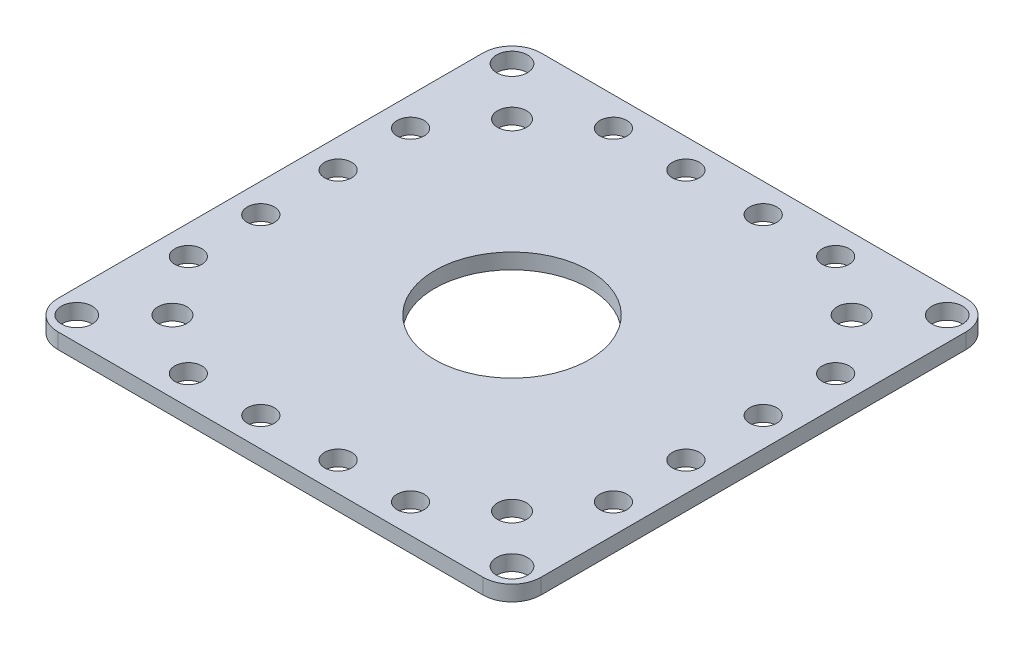
ISO-10303-21;
HEADER;
FILE_DESCRIPTION(('STEP AP214'),'2;1');
FILE_NAME('part.step','',(''),(''),'','','');
FILE_SCHEMA(('AUTOMOTIVE_DESIGN { 1 0 10303 214 1 1 1 1 }'));
ENDSEC;
DATA;
#1=APPLICATION_CONTEXT('core data for automotive mechanical design processes');
#2=APPLICATION_PROTOCOL_DEFINITION('international standard','automotive_design',2000,#1);
#3=PRODUCT_CONTEXT('',#1,'mechanical');
#4=PRODUCT('Part','Part','',(#3));
#5=PRODUCT_RELATED_PRODUCT_CATEGORY('part','',(#4));
#6=PRODUCT_DEFINITION_FORMATION('','',#4);
#7=PRODUCT_DEFINITION_CONTEXT('part definition',#1,'design');
#8=PRODUCT_DEFINITION('design','',#6,#7);
#9=PRODUCT_DEFINITION_SHAPE('','',#8);
#10=(LENGTH_UNIT() NAMED_UNIT(*) SI_UNIT(.MILLI.,.METRE.));
#11=(NAMED_UNIT(*) PLANE_ANGLE_UNIT() SI_UNIT($,.RADIAN.));
#12=(NAMED_UNIT(*) SI_UNIT($,.STERADIAN.) SOLID_ANGLE_UNIT());
#13=UNCERTAINTY_MEASURE_WITH_UNIT(LENGTH_MEASURE(1.E-05),#10,'distance_accuracy_value','');
#14=(GEOMETRIC_REPRESENTATION_CONTEXT(3) GLOBAL_UNCERTAINTY_ASSIGNED_CONTEXT((#13)) GLOBAL_UNIT_ASSIGNED_CONTEXT((#10,
#11,#12)) REPRESENTATION_CONTEXT('',''));
#15=CARTESIAN_POINT('',(0.,0.,0.));
#16=DIRECTION('',(0.,0.,1.));
#17=DIRECTION('',(1.,0.,0.));
#18=AXIS2_PLACEMENT_3D('',#15,#16,#17);
#19=CARTESIAN_POINT('',(0.,1.6,0.));
#20=DIRECTION('',(0.,-1.,0.));
#21=DIRECTION('',(0.,0.,-1.));
#22=AXIS2_PLACEMENT_3D('',#19,#20,#21);
#23=PLANE('',#22);
#24=DIRECTION('',(1.,0.,0.));
#25=VECTOR('',#24,1.);
#26=CARTESIAN_POINT('',(-25.,1.6,25.));
#27=LINE('',#26,#25);
#28=CARTESIAN_POINT('',(-22.,1.6,25.));
#29=VERTEX_POINT('',#28);
#30=CARTESIAN_POINT('',(22.,1.6,25.));
#31=VERTEX_POINT('',#30);
#32=EDGE_CURVE('E158',#29,#31,#27,.T.);
#33=ORIENTED_EDGE('',*,*,#32,.T.);
#34=CARTESIAN_POINT('',(22.,1.6,22.));
#35=DIRECTION('',(0.,-1.,0.));
#36=DIRECTION('',(0.,0.,-1.));
#37=AXIS2_PLACEMENT_3D('',#34,#35,#36);
#38=CIRCLE('',#37,3.);
#39=CARTESIAN_POINT('',(25.,1.6,22.));
#40=VERTEX_POINT('',#39);
#41=EDGE_CURVE('E187',#31,#40,#38,.F.);
#42=ORIENTED_EDGE('',*,*,#41,.T.);
#43=DIRECTION('',(0.,0.,-1.));
#44=VECTOR('',#43,1.);
#45=CARTESIAN_POINT('',(25.,1.6,25.));
#46=LINE('',#45,#44);
#47=CARTESIAN_POINT('',(25.,1.6,-22.));
#48=VERTEX_POINT('',#47);
#49=EDGE_CURVE('E136',#40,#48,#46,.T.);
#50=ORIENTED_EDGE('',*,*,#49,.T.);
#51=CARTESIAN_POINT('',(22.,1.6,-22.));
#52=DIRECTION('',(0.,-1.,0.));
#53=DIRECTION('',(0.,0.,-1.));
#54=AXIS2_PLACEMENT_3D('',#51,#52,#53);
#55=CIRCLE('',#54,3.);
#56=CARTESIAN_POINT('',(22.,1.6,-25.));
#57=VERTEX_POINT('',#56);
#58=EDGE_CURVE('E181',#48,#57,#55,.F.);
#59=ORIENTED_EDGE('',*,*,#58,.T.);
#60=DIRECTION('',(-1.,0.,0.));
#61=VECTOR('',#60,1.);
#62=CARTESIAN_POINT('',(-25.,1.6,-25.));
#63=LINE('',#62,#61);
#64=CARTESIAN_POINT('',(-22.,1.6,-25.));
#65=VERTEX_POINT('',#64);
#66=EDGE_CURVE('E200',#57,#65,#63,.T.);
#67=ORIENTED_EDGE('',*,*,#66,.T.);
#68=CARTESIAN_POINT('',(-22.,1.6,-22.));
#69=DIRECTION('',(0.,-1.,0.));
#70=DIRECTION('',(0.,0.,-1.));
#71=AXIS2_PLACEMENT_3D('',#68,#69,#70);
#72=CIRCLE('',#71,3.);
#73=CARTESIAN_POINT('',(-25.,1.6,-22.));
#74=VERTEX_POINT('',#73);
#75=EDGE_CURVE('E70',#65,#74,#72,.F.);
#76=ORIENTED_EDGE('',*,*,#75,.T.);
#77=DIRECTION('',(0.,0.,1.));
#78=VECTOR('',#77,1.);
#79=CARTESIAN_POINT('',(-25.,1.6,25.));
#80=LINE('',#79,#78);
#81=CARTESIAN_POINT('',(-25.,1.6,22.));
#82=VERTEX_POINT('',#81);
#83=EDGE_CURVE('E207',#74,#82,#80,.T.);
#84=ORIENTED_EDGE('',*,*,#83,.T.);
#85=CARTESIAN_POINT('',(-22.,1.6,22.));
#86=DIRECTION('',(0.,-1.,0.));
#87=DIRECTION('',(0.,0.,-1.));
#88=AXIS2_PLACEMENT_3D('',#85,#86,#87);
#89=CIRCLE('',#88,3.);
#90=EDGE_CURVE('E184',#82,#29,#89,.F.);
#91=ORIENTED_EDGE('',*,*,#90,.T.);
#92=EDGE_LOOP('',(#33,#42,#50,#59,#67,#76,#84,#91));
#93=FACE_BOUND('',#92,.T.);
#94=CARTESIAN_POINT('',(0.,1.6,0.));
#95=DIRECTION('',(0.,1.,0.));
#96=DIRECTION('',(0.,0.,1.));
#97=AXIS2_PLACEMENT_3D('',#94,#95,#96);
#98=CIRCLE('',#97,8.);
#99=CARTESIAN_POINT('',(0.,1.6,8.));
#100=VERTEX_POINT('',#99);
#101=EDGE_CURVE('E147',#100,#100,#98,.T.);
#102=ORIENTED_EDGE('',*,*,#101,.F.);
#103=EDGE_LOOP('',(#102));
#104=FACE_BOUND('',#103,.T.);
#105=CARTESIAN_POINT('',(-22.5251262658471,1.6,-22.5251262658471));
#106=DIRECTION('',(0.,1.,0.));
#107=DIRECTION('',(0.,0.,1.));
#108=AXIS2_PLACEMENT_3D('',#105,#106,#107);
#109=CIRCLE('',#108,1.6);
#110=CARTESIAN_POINT('',(-22.5251262658471,1.6,-20.9251262658471));
#111=VERTEX_POINT('',#110);
#112=EDGE_CURVE('E226',#111,#111,#109,.T.);
#113=ORIENTED_EDGE('',*,*,#112,.F.);
#114=EDGE_LOOP('',(#113));
#115=FACE_BOUND('',#114,.T.);
#116=CARTESIAN_POINT('',(-17.5753787975412,1.6,-17.5753787975413));
#117=DIRECTION('',(0.,1.,0.));
#118=DIRECTION('',(0.,0.,1.));
#119=AXIS2_PLACEMENT_3D('',#116,#117,#118);
#120=CIRCLE('',#119,1.5);
#121=CARTESIAN_POINT('',(-17.5753787975412,1.6,-16.0753787975413));
#122=VERTEX_POINT('',#121);
#123=EDGE_CURVE('E232',#122,#122,#120,.T.);
#124=ORIENTED_EDGE('',*,*,#123,.F.);
#125=EDGE_LOOP('',(#124));
#126=FACE_BOUND('',#125,.T.);
#127=CARTESIAN_POINT('',(-4.,1.6,-22.));
#128=DIRECTION('',(0.,1.,0.));
#129=DIRECTION('',(0.,0.,1.));
#130=AXIS2_PLACEMENT_3D('',#127,#128,#129);
#131=CIRCLE('',#130,1.4);
#132=CARTESIAN_POINT('',(-4.,1.6,-20.6));
#133=VERTEX_POINT('',#132);
#134=EDGE_CURVE('E240',#133,#133,#131,.T.);
#135=ORIENTED_EDGE('',*,*,#134,.F.);
#136=EDGE_LOOP('',(#135));
#137=FACE_BOUND('',#136,.T.);
#138=CARTESIAN_POINT('',(-11.5,1.6,-22.));
#139=DIRECTION('',(0.,1.,0.));
#140=DIRECTION('',(0.,0.,1.));
#141=AXIS2_PLACEMENT_3D('',#138,#139,#140);
#142=CIRCLE('',#141,1.4);
#143=CARTESIAN_POINT('',(-11.5,1.6,-20.6));
#144=VERTEX_POINT('',#143);
#145=EDGE_CURVE('E248',#144,#144,#142,.T.);
#146=ORIENTED_EDGE('',*,*,#145,.F.);
#147=EDGE_LOOP('',(#146));
#148=FACE_BOUND('',#147,.T.);
#149=CARTESIAN_POINT('',(4.,1.6,-22.));
#150=DIRECTION('',(0.,1.,0.));
#151=DIRECTION('',(0.,0.,-1.));
#152=AXIS2_PLACEMENT_3D('',#149,#150,#151);
#153=CIRCLE('',#152,1.4);
#154=CARTESIAN_POINT('',(4.,1.6,-23.4));
#155=VERTEX_POINT('',#154);
#156=EDGE_CURVE('E256',#155,#155,#153,.T.);
#157=ORIENTED_EDGE('',*,*,#156,.F.);
#158=EDGE_LOOP('',(#157));
#159=FACE_BOUND('',#158,.T.);
#160=CARTESIAN_POINT('',(11.5,1.6,-22.));
#161=DIRECTION('',(0.,1.,0.));
#162=DIRECTION('',(0.,0.,-1.));
#163=AXIS2_PLACEMENT_3D('',#160,#161,#162);
#164=CIRCLE('',#163,1.4);
#165=CARTESIAN_POINT('',(11.5,1.6,-23.4));
#166=VERTEX_POINT('',#165);
#167=EDGE_CURVE('E264',#166,#166,#164,.T.);
#168=ORIENTED_EDGE('',*,*,#167,.F.);
#169=EDGE_LOOP('',(#168));
#170=FACE_BOUND('',#169,.T.);
#171=CARTESIAN_POINT('',(22.0000000000012,1.6,-4.00000000000194));
#172=DIRECTION('',(0.,1.,0.));
#173=DIRECTION('',(0.,0.,1.));
#174=AXIS2_PLACEMENT_3D('',#171,#172,#173);
#175=CIRCLE('',#174,1.40000000000159);
#176=CARTESIAN_POINT('',(22.0000000000012,1.6,-2.60000000000035));
#177=VERTEX_POINT('',#176);
#178=EDGE_CURVE('E272',#177,#177,#175,.T.);
#179=ORIENTED_EDGE('',*,*,#178,.F.);
#180=EDGE_LOOP('',(#179));
#181=FACE_BOUND('',#180,.T.);
#182=CARTESIAN_POINT('',(22.0000000000012,1.6,-11.5000000000019));
#183=DIRECTION('',(0.,1.,0.));
#184=DIRECTION('',(0.,0.,1.));
#185=AXIS2_PLACEMENT_3D('',#182,#183,#184);
#186=CIRCLE('',#185,1.4000000000016);
#187=CARTESIAN_POINT('',(22.0000000000012,1.6,-10.1000000000003));
#188=VERTEX_POINT('',#187);
#189=EDGE_CURVE('E280',#188,#188,#186,.T.);
#190=ORIENTED_EDGE('',*,*,#189,.F.);
#191=EDGE_LOOP('',(#190));
#192=FACE_BOUND('',#191,.T.);
#193=CARTESIAN_POINT('',(22.0000000000012,1.6,3.99999999999806));
#194=DIRECTION('',(0.,1.,0.));
#195=DIRECTION('',(0.,0.,-1.));
#196=AXIS2_PLACEMENT_3D('',#193,#194,#195);
#197=CIRCLE('',#196,1.39999999999772);
#198=CARTESIAN_POINT('',(22.0000000000012,1.6,2.60000000000034));
#199=VERTEX_POINT('',#198);
#200=EDGE_CURVE('E288',#199,#199,#197,.T.);
#201=ORIENTED_EDGE('',*,*,#200,.F.);
#202=EDGE_LOOP('',(#201));
#203=FACE_BOUND('',#202,.T.);
#204=CARTESIAN_POINT('',(22.0000000000012,1.6,11.4999999999981));
#205=DIRECTION('',(0.,1.,0.));
#206=DIRECTION('',(0.,0.,-1.));
#207=AXIS2_PLACEMENT_3D('',#204,#205,#206);
#208=CIRCLE('',#207,1.39999999999772);
#209=CARTESIAN_POINT('',(22.0000000000012,1.6,10.1000000000003));
#210=VERTEX_POINT('',#209);
#211=EDGE_CURVE('E296',#210,#210,#208,.T.);
#212=ORIENTED_EDGE('',*,*,#211,.F.);
#213=EDGE_LOOP('',(#212));
#214=FACE_BOUND('',#213,.T.);
#215=CARTESIAN_POINT('',(4.00000000000312,1.6,21.9999999999992));
#216=DIRECTION('',(0.,1.,0.));
#217=DIRECTION('',(0.,0.,1.));
#218=AXIS2_PLACEMENT_3D('',#215,#216,#217);
#219=CIRCLE('',#218,1.40000000000336);
#220=CARTESIAN_POINT('',(4.00000000000312,1.6,23.4000000000026));
#221=VERTEX_POINT('',#220);
#222=EDGE_CURVE('E304',#221,#221,#219,.T.);
#223=ORIENTED_EDGE('',*,*,#222,.F.);
#224=EDGE_LOOP('',(#223));
#225=FACE_BOUND('',#224,.T.);
#226=CARTESIAN_POINT('',(11.5000000000031,1.6,21.9999999999992));
#227=DIRECTION('',(0.,1.,0.));
#228=DIRECTION('',(0.,0.,1.));
#229=AXIS2_PLACEMENT_3D('',#226,#227,#228);
#230=CIRCLE('',#229,1.40000000000338);
#231=CARTESIAN_POINT('',(11.5000000000031,1.6,23.4000000000026));
#232=VERTEX_POINT('',#231);
#233=EDGE_CURVE('E312',#232,#232,#230,.T.);
#234=ORIENTED_EDGE('',*,*,#233,.F.);
#235=EDGE_LOOP('',(#234));
#236=FACE_BOUND('',#235,.T.);
#237=CARTESIAN_POINT('',(-3.99999999999688,1.6,21.9999999999992));
#238=DIRECTION('',(0.,1.,0.));
#239=DIRECTION('',(0.,0.,-1.));
#240=AXIS2_PLACEMENT_3D('',#237,#238,#239);
#241=CIRCLE('',#240,1.39999999999709);
#242=CARTESIAN_POINT('',(-3.99999999999688,1.6,20.6000000000022));
#243=VERTEX_POINT('',#242);
#244=EDGE_CURVE('E320',#243,#243,#241,.T.);
#245=ORIENTED_EDGE('',*,*,#244,.F.);
#246=EDGE_LOOP('',(#245));
#247=FACE_BOUND('',#246,.T.);
#248=CARTESIAN_POINT('',(-11.4999999999969,1.6,21.9999999999992));
#249=DIRECTION('',(0.,1.,0.));
#250=DIRECTION('',(0.,0.,-1.));
#251=AXIS2_PLACEMENT_3D('',#248,#249,#250);
#252=CIRCLE('',#251,1.39999999999707);
#253=CARTESIAN_POINT('',(-11.4999999999969,1.6,20.6000000000022));
#254=VERTEX_POINT('',#253);
#255=EDGE_CURVE('E328',#254,#254,#252,.T.);
#256=ORIENTED_EDGE('',*,*,#255,.F.);
#257=EDGE_LOOP('',(#256));
#258=FACE_BOUND('',#257,.T.);
#259=CARTESIAN_POINT('',(-21.9999999999981,1.6,4.00000000000118));
#260=DIRECTION('',(0.,1.,0.));
#261=DIRECTION('',(0.,0.,1.));
#262=AXIS2_PLACEMENT_3D('',#259,#260,#261);
#263=CIRCLE('',#262,1.40000000000193);
#264=CARTESIAN_POINT('',(-21.9999999999981,1.6,5.40000000000311));
#265=VERTEX_POINT('',#264);
#266=EDGE_CURVE('E336',#265,#265,#263,.T.);
#267=ORIENTED_EDGE('',*,*,#266,.F.);
#268=EDGE_LOOP('',(#267));
#269=FACE_BOUND('',#268,.T.);
#270=CARTESIAN_POINT('',(-21.9999999999981,1.6,11.5000000000012));
#271=DIRECTION('',(0.,1.,0.));
#272=DIRECTION('',(0.,0.,1.));
#273=AXIS2_PLACEMENT_3D('',#270,#271,#272);
#274=CIRCLE('',#273,1.40000000000195);
#275=CARTESIAN_POINT('',(-21.9999999999981,1.6,12.9000000000031));
#276=VERTEX_POINT('',#275);
#277=EDGE_CURVE('E344',#276,#276,#274,.T.);
#278=ORIENTED_EDGE('',*,*,#277,.F.);
#279=EDGE_LOOP('',(#278));
#280=FACE_BOUND('',#279,.T.);
#281=CARTESIAN_POINT('',(-21.9999999999981,1.6,-3.99999999999882));
#282=DIRECTION('',(0.,1.,0.));
#283=DIRECTION('',(0.,0.,-1.));
#284=AXIS2_PLACEMENT_3D('',#281,#282,#283);
#285=CIRCLE('',#284,1.3999999999992);
#286=CARTESIAN_POINT('',(-21.9999999999981,1.6,-5.39999999999802));
#287=VERTEX_POINT('',#286);
#288=EDGE_CURVE('E352',#287,#287,#285,.T.);
#289=ORIENTED_EDGE('',*,*,#288,.F.);
#290=EDGE_LOOP('',(#289));
#291=FACE_BOUND('',#290,.T.);
#292=CARTESIAN_POINT('',(-21.9999999999981,1.6,-11.4999999999988));
#293=DIRECTION('',(0.,1.,0.));
#294=DIRECTION('',(0.,0.,-1.));
#295=AXIS2_PLACEMENT_3D('',#292,#293,#294);
#296=CIRCLE('',#295,1.39999999999918);
#297=CARTESIAN_POINT('',(-21.9999999999981,1.6,-12.899999999998));
#298=VERTEX_POINT('',#297);
#299=EDGE_CURVE('E360',#298,#298,#296,.T.);
#300=ORIENTED_EDGE('',*,*,#299,.F.);
#301=EDGE_LOOP('',(#300));
#302=FACE_BOUND('',#301,.T.);
#303=CARTESIAN_POINT('',(22.5251262658471,1.6,-22.5251262658487));
#304=DIRECTION('',(0.,1.,0.));
#305=DIRECTION('',(0.,0.,1.));
#306=AXIS2_PLACEMENT_3D('',#303,#304,#305);
#307=CIRCLE('',#306,1.60000000000166);
#308=CARTESIAN_POINT('',(22.5251262658471,1.6,-20.9251262658471));
#309=VERTEX_POINT('',#308);
#310=EDGE_CURVE('E368',#309,#309,#307,.T.);
#311=ORIENTED_EDGE('',*,*,#310,.F.);
#312=EDGE_LOOP('',(#311));
#313=FACE_BOUND('',#312,.T.);
#314=CARTESIAN_POINT('',(17.5753787975413,1.6,-17.5753787975429));
#315=DIRECTION('',(0.,1.,0.));
#316=DIRECTION('',(0.,0.,1.));
#317=AXIS2_PLACEMENT_3D('',#314,#315,#316);
#318=CIRCLE('',#317,1.50000000000164);
#319=CARTESIAN_POINT('',(17.5753787975413,1.6,-16.0753787975412));
#320=VERTEX_POINT('',#319);
#321=EDGE_CURVE('E376',#320,#320,#318,.T.);
#322=ORIENTED_EDGE('',*,*,#321,.F.);
#323=EDGE_LOOP('',(#322));
#324=FACE_BOUND('',#323,.T.);
#325=CARTESIAN_POINT('',(22.5251262658487,1.6,22.5251262658455));
#326=DIRECTION('',(0.,1.,0.));
#327=DIRECTION('',(0.,0.,1.));
#328=AXIS2_PLACEMENT_3D('',#325,#326,#327);
#329=CIRCLE('',#328,1.60000000000226);
#330=CARTESIAN_POINT('',(22.5251262658487,1.6,24.1251262658477));
#331=VERTEX_POINT('',#330);
#332=EDGE_CURVE('E384',#331,#331,#329,.T.);
#333=ORIENTED_EDGE('',*,*,#332,.F.);
#334=EDGE_LOOP('',(#333));
#335=FACE_BOUND('',#334,.T.);
#336=CARTESIAN_POINT('',(17.5753787975429,1.6,17.5753787975396));
#337=DIRECTION('',(0.,1.,0.));
#338=DIRECTION('',(0.,0.,1.));
#339=AXIS2_PLACEMENT_3D('',#336,#337,#338);
#340=CIRCLE('',#339,1.50000000000222);
#341=CARTESIAN_POINT('',(17.5753787975429,1.6,19.0753787975418));
#342=VERTEX_POINT('',#341);
#343=EDGE_CURVE('E392',#342,#342,#340,.T.);
#344=ORIENTED_EDGE('',*,*,#343,.F.);
#345=EDGE_LOOP('',(#344));
#346=FACE_BOUND('',#345,.T.);
#347=CARTESIAN_POINT('',(-22.5251262658455,1.6,22.5251262658471));
#348=DIRECTION('',(0.,1.,0.));
#349=DIRECTION('',(0.,0.,1.));
#350=AXIS2_PLACEMENT_3D('',#347,#348,#349);
#351=CIRCLE('',#350,1.6000000000008);
#352=CARTESIAN_POINT('',(-22.5251262658455,1.6,24.1251262658479));
#353=VERTEX_POINT('',#352);
#354=EDGE_CURVE('E400',#353,#353,#351,.T.);
#355=ORIENTED_EDGE('',*,*,#354,.F.);
#356=EDGE_LOOP('',(#355));
#357=FACE_BOUND('',#356,.T.);
#358=CARTESIAN_POINT('',(-17.5753787975396,1.6,17.5753787975413));
#359=DIRECTION('',(0.,1.,0.));
#360=DIRECTION('',(0.,0.,1.));
#361=AXIS2_PLACEMENT_3D('',#358,#359,#360);
#362=CIRCLE('',#361,1.50000000000074);
#363=CARTESIAN_POINT('',(-17.5753787975396,1.6,19.075378797542));
#364=VERTEX_POINT('',#363);
#365=EDGE_CURVE('E408',#364,#364,#362,.T.);
#366=ORIENTED_EDGE('',*,*,#365,.F.);
#367=EDGE_LOOP('',(#366));
#368=FACE_BOUND('',#367,.T.);
#369=ADVANCED_FACE('F47',(#93,#104,#115,#126,#137,#148,#159,#170,#181,#192,#203,#214,#225,#236,
#247,#258,#269,#280,#291,#302,#313,#324,#335,#346,#357,#368),#23,.F.);
#370=CARTESIAN_POINT('',(0.,0.,0.));
#371=DIRECTION('',(0.,-1.,0.));
#372=DIRECTION('',(0.,0.,-1.));
#373=AXIS2_PLACEMENT_3D('',#370,#371,#372);
#374=PLANE('',#373);
#375=CARTESIAN_POINT('',(-22.5251262658455,0.,22.5251262658471));
#376=DIRECTION('',(0.,1.,0.));
#377=DIRECTION('',(0.,0.,1.));
#378=AXIS2_PLACEMENT_3D('',#375,#376,#377);
#379=CIRCLE('',#378,1.6000000000008);
#380=CARTESIAN_POINT('',(-22.5251262658455,0.,24.1251262658479));
#381=VERTEX_POINT('',#380);
#382=EDGE_CURVE('E404',#381,#381,#379,.T.);
#383=ORIENTED_EDGE('',*,*,#382,.T.);
#384=EDGE_LOOP('',(#383));
#385=FACE_BOUND('',#384,.T.);
#386=CARTESIAN_POINT('',(22.5251262658487,0.,22.5251262658455));
#387=DIRECTION('',(0.,1.,0.));
#388=DIRECTION('',(0.,0.,1.));
#389=AXIS2_PLACEMENT_3D('',#386,#387,#388);
#390=CIRCLE('',#389,1.60000000000226);
#391=CARTESIAN_POINT('',(22.5251262658487,0.,24.1251262658477));
#392=VERTEX_POINT('',#391);
#393=EDGE_CURVE('E388',#392,#392,#390,.T.);
#394=ORIENTED_EDGE('',*,*,#393,.T.);
#395=EDGE_LOOP('',(#394));
#396=FACE_BOUND('',#395,.T.);
#397=CARTESIAN_POINT('',(22.5251262658471,0.,-22.5251262658487));
#398=DIRECTION('',(0.,1.,0.));
#399=DIRECTION('',(0.,0.,1.));
#400=AXIS2_PLACEMENT_3D('',#397,#398,#399);
#401=CIRCLE('',#400,1.60000000000166);
#402=CARTESIAN_POINT('',(22.5251262658471,0.,-20.9251262658471));
#403=VERTEX_POINT('',#402);
#404=EDGE_CURVE('E372',#403,#403,#401,.T.);
#405=ORIENTED_EDGE('',*,*,#404,.T.);
#406=EDGE_LOOP('',(#405));
#407=FACE_BOUND('',#406,.T.);
#408=CARTESIAN_POINT('',(-21.9999999999981,0.,-3.99999999999882));
#409=DIRECTION('',(0.,1.,0.));
#410=DIRECTION('',(0.,0.,-1.));
#411=AXIS2_PLACEMENT_3D('',#408,#409,#410);
#412=CIRCLE('',#411,1.3999999999992);
#413=CARTESIAN_POINT('',(-21.9999999999981,0.,-5.39999999999802));
#414=VERTEX_POINT('',#413);
#415=EDGE_CURVE('E356',#414,#414,#412,.T.);
#416=ORIENTED_EDGE('',*,*,#415,.T.);
#417=EDGE_LOOP('',(#416));
#418=FACE_BOUND('',#417,.T.);
#419=CARTESIAN_POINT('',(-21.9999999999981,0.,4.00000000000118));
#420=DIRECTION('',(0.,1.,0.));
#421=DIRECTION('',(0.,0.,1.));
#422=AXIS2_PLACEMENT_3D('',#419,#420,#421);
#423=CIRCLE('',#422,1.40000000000193);
#424=CARTESIAN_POINT('',(-21.9999999999981,0.,5.40000000000311));
#425=VERTEX_POINT('',#424);
#426=EDGE_CURVE('E340',#425,#425,#423,.T.);
#427=ORIENTED_EDGE('',*,*,#426,.T.);
#428=EDGE_LOOP('',(#427));
#429=FACE_BOUND('',#428,.T.);
#430=CARTESIAN_POINT('',(-3.99999999999688,0.,21.9999999999992));
#431=DIRECTION('',(0.,1.,0.));
#432=DIRECTION('',(0.,0.,-1.));
#433=AXIS2_PLACEMENT_3D('',#430,#431,#432);
#434=CIRCLE('',#433,1.39999999999709);
#435=CARTESIAN_POINT('',(-3.99999999999688,0.,20.6000000000022));
#436=VERTEX_POINT('',#435);
#437=EDGE_CURVE('E324',#436,#436,#434,.T.);
#438=ORIENTED_EDGE('',*,*,#437,.T.);
#439=EDGE_LOOP('',(#438));
#440=FACE_BOUND('',#439,.T.);
#441=CARTESIAN_POINT('',(4.00000000000312,0.,21.9999999999992));
#442=DIRECTION('',(0.,1.,0.));
#443=DIRECTION('',(0.,0.,1.));
#444=AXIS2_PLACEMENT_3D('',#441,#442,#443);
#445=CIRCLE('',#444,1.40000000000336);
#446=CARTESIAN_POINT('',(4.00000000000312,0.,23.4000000000026));
#447=VERTEX_POINT('',#446);
#448=EDGE_CURVE('E308',#447,#447,#445,.T.);
#449=ORIENTED_EDGE('',*,*,#448,.T.);
#450=EDGE_LOOP('',(#449));
#451=FACE_BOUND('',#450,.T.);
#452=CARTESIAN_POINT('',(22.0000000000012,0.,3.99999999999806));
#453=DIRECTION('',(0.,1.,0.));
#454=DIRECTION('',(0.,0.,-1.));
#455=AXIS2_PLACEMENT_3D('',#452,#453,#454);
#456=CIRCLE('',#455,1.39999999999772);
#457=CARTESIAN_POINT('',(22.0000000000012,0.,2.60000000000034));
#458=VERTEX_POINT('',#457);
#459=EDGE_CURVE('E292',#458,#458,#456,.T.);
#460=ORIENTED_EDGE('',*,*,#459,.T.);
#461=EDGE_LOOP('',(#460));
#462=FACE_BOUND('',#461,.T.);
#463=CARTESIAN_POINT('',(22.0000000000012,0.,-4.00000000000194));
#464=DIRECTION('',(0.,1.,0.));
#465=DIRECTION('',(0.,0.,1.));
#466=AXIS2_PLACEMENT_3D('',#463,#464,#465);
#467=CIRCLE('',#466,1.40000000000159);
#468=CARTESIAN_POINT('',(22.0000000000012,0.,-2.60000000000035));
#469=VERTEX_POINT('',#468);
#470=EDGE_CURVE('E276',#469,#469,#467,.T.);
#471=ORIENTED_EDGE('',*,*,#470,.T.);
#472=EDGE_LOOP('',(#471));
#473=FACE_BOUND('',#472,.T.);
#474=CARTESIAN_POINT('',(4.,0.,-22.));
#475=DIRECTION('',(0.,1.,0.));
#476=DIRECTION('',(0.,0.,-1.));
#477=AXIS2_PLACEMENT_3D('',#474,#475,#476);
#478=CIRCLE('',#477,1.4);
#479=CARTESIAN_POINT('',(4.,0.,-23.4));
#480=VERTEX_POINT('',#479);
#481=EDGE_CURVE('E260',#480,#480,#478,.T.);
#482=ORIENTED_EDGE('',*,*,#481,.T.);
#483=EDGE_LOOP('',(#482));
#484=FACE_BOUND('',#483,.T.);
#485=CARTESIAN_POINT('',(-4.,0.,-22.));
#486=DIRECTION('',(0.,1.,0.));
#487=DIRECTION('',(0.,0.,1.));
#488=AXIS2_PLACEMENT_3D('',#485,#486,#487);
#489=CIRCLE('',#488,1.4);
#490=CARTESIAN_POINT('',(-4.,0.,-20.6));
#491=VERTEX_POINT('',#490);
#492=EDGE_CURVE('E244',#491,#491,#489,.T.);
#493=ORIENTED_EDGE('',*,*,#492,.T.);
#494=EDGE_LOOP('',(#493));
#495=FACE_BOUND('',#494,.T.);
#496=CARTESIAN_POINT('',(-22.5251262658471,0.,-22.5251262658471));
#497=DIRECTION('',(0.,1.,0.));
#498=DIRECTION('',(0.,0.,1.));
#499=AXIS2_PLACEMENT_3D('',#496,#497,#498);
#500=CIRCLE('',#499,1.6);
#501=CARTESIAN_POINT('',(-22.5251262658471,0.,-20.9251262658471));
#502=VERTEX_POINT('',#501);
#503=EDGE_CURVE('E228',#502,#502,#500,.T.);
#504=ORIENTED_EDGE('',*,*,#503,.T.);
#505=EDGE_LOOP('',(#504));
#506=FACE_BOUND('',#505,.T.);
#507=DIRECTION('',(0.,0.,-1.));
#508=VECTOR('',#507,1.);
#509=CARTESIAN_POINT('',(25.,0.,25.));
#510=LINE('',#509,#508);
#511=CARTESIAN_POINT('',(25.,0.,22.));
#512=VERTEX_POINT('',#511);
#513=CARTESIAN_POINT('',(25.,0.,-22.));
#514=VERTEX_POINT('',#513);
#515=EDGE_CURVE('E133',#512,#514,#510,.T.);
#516=ORIENTED_EDGE('',*,*,#515,.F.);
#517=CARTESIAN_POINT('',(22.,0.,22.));
#518=DIRECTION('',(0.,-1.,0.));
#519=DIRECTION('',(0.,0.,-1.));
#520=AXIS2_PLACEMENT_3D('',#517,#518,#519);
#521=CIRCLE('',#520,3.);
#522=CARTESIAN_POINT('',(22.,0.,25.));
#523=VERTEX_POINT('',#522);
#524=EDGE_CURVE('E115',#512,#523,#521,.T.);
#525=ORIENTED_EDGE('',*,*,#524,.T.);
#526=DIRECTION('',(1.,0.,0.));
#527=VECTOR('',#526,1.);
#528=CARTESIAN_POINT('',(-25.,0.,25.));
#529=LINE('',#528,#527);
#530=CARTESIAN_POINT('',(-22.,0.,25.));
#531=VERTEX_POINT('',#530);
#532=EDGE_CURVE('E163',#531,#523,#529,.T.);
#533=ORIENTED_EDGE('',*,*,#532,.F.);
#534=CARTESIAN_POINT('',(-22.,0.,22.));
#535=DIRECTION('',(0.,-1.,0.));
#536=DIRECTION('',(0.,0.,-1.));
#537=AXIS2_PLACEMENT_3D('',#534,#535,#536);
#538=CIRCLE('',#537,3.);
#539=CARTESIAN_POINT('',(-25.,0.,22.));
#540=VERTEX_POINT('',#539);
#541=EDGE_CURVE('E127',#531,#540,#538,.T.);
#542=ORIENTED_EDGE('',*,*,#541,.T.);
#543=DIRECTION('',(0.,0.,1.));
#544=VECTOR('',#543,1.);
#545=CARTESIAN_POINT('',(-25.,0.,25.));
#546=LINE('',#545,#544);
#547=CARTESIAN_POINT('',(-25.,0.,-22.));
#548=VERTEX_POINT('',#547);
#549=EDGE_CURVE('E152',#548,#540,#546,.T.);
#550=ORIENTED_EDGE('',*,*,#549,.F.);
#551=CARTESIAN_POINT('',(-22.,0.,-22.));
#552=DIRECTION('',(0.,-1.,0.));
#553=DIRECTION('',(0.,0.,-1.));
#554=AXIS2_PLACEMENT_3D('',#551,#552,#553);
#555=CIRCLE('',#554,3.);
#556=CARTESIAN_POINT('',(-22.,0.,-25.));
#557=VERTEX_POINT('',#556);
#558=EDGE_CURVE('E138',#548,#557,#555,.T.);
#559=ORIENTED_EDGE('',*,*,#558,.T.);
#560=DIRECTION('',(-1.,0.,0.));
#561=VECTOR('',#560,1.);
#562=CARTESIAN_POINT('',(-25.,0.,-25.));
#563=LINE('',#562,#561);
#564=CARTESIAN_POINT('',(22.,0.,-25.));
#565=VERTEX_POINT('',#564);
#566=EDGE_CURVE('E146',#565,#557,#563,.T.);
#567=ORIENTED_EDGE('',*,*,#566,.F.);
#568=CARTESIAN_POINT('',(22.,0.,-22.));
#569=DIRECTION('',(0.,-1.,0.));
#570=DIRECTION('',(0.,0.,-1.));
#571=AXIS2_PLACEMENT_3D('',#568,#569,#570);
#572=CIRCLE('',#571,3.);
#573=EDGE_CURVE('E144',#565,#514,#572,.T.);
#574=ORIENTED_EDGE('',*,*,#573,.T.);
#575=EDGE_LOOP('',(#516,#525,#533,#542,#550,#559,#567,#574));
#576=FACE_BOUND('',#575,.T.);
#577=CARTESIAN_POINT('',(0.,0.,0.));
#578=DIRECTION('',(0.,1.,0.));
#579=DIRECTION('',(0.,0.,1.));
#580=AXIS2_PLACEMENT_3D('',#577,#578,#579);
#581=CIRCLE('',#580,8.);
#582=CARTESIAN_POINT('',(0.,0.,8.));
#583=VERTEX_POINT('',#582);
#584=EDGE_CURVE('E155',#583,#583,#581,.T.);
#585=ORIENTED_EDGE('',*,*,#584,.T.);
#586=EDGE_LOOP('',(#585));
#587=FACE_BOUND('',#586,.T.);
#588=CARTESIAN_POINT('',(-17.5753787975412,0.,-17.5753787975413));
#589=DIRECTION('',(0.,1.,0.));
#590=DIRECTION('',(0.,0.,1.));
#591=AXIS2_PLACEMENT_3D('',#588,#589,#590);
#592=CIRCLE('',#591,1.5);
#593=CARTESIAN_POINT('',(-17.5753787975412,0.,-16.0753787975413));
#594=VERTEX_POINT('',#593);
#595=EDGE_CURVE('E236',#594,#594,#592,.T.);
#596=ORIENTED_EDGE('',*,*,#595,.T.);
#597=EDGE_LOOP('',(#596));
#598=FACE_BOUND('',#597,.T.);
#599=CARTESIAN_POINT('',(-11.5,0.,-22.));
#600=DIRECTION('',(0.,1.,0.));
#601=DIRECTION('',(0.,0.,1.));
#602=AXIS2_PLACEMENT_3D('',#599,#600,#601);
#603=CIRCLE('',#602,1.4);
#604=CARTESIAN_POINT('',(-11.5,0.,-20.6));
#605=VERTEX_POINT('',#604);
#606=EDGE_CURVE('E252',#605,#605,#603,.T.);
#607=ORIENTED_EDGE('',*,*,#606,.T.);
#608=EDGE_LOOP('',(#607));
#609=FACE_BOUND('',#608,.T.);
#610=CARTESIAN_POINT('',(11.5,0.,-22.));
#611=DIRECTION('',(0.,1.,0.));
#612=DIRECTION('',(0.,0.,-1.));
#613=AXIS2_PLACEMENT_3D('',#610,#611,#612);
#614=CIRCLE('',#613,1.4);
#615=CARTESIAN_POINT('',(11.5,0.,-23.4));
#616=VERTEX_POINT('',#615);
#617=EDGE_CURVE('E268',#616,#616,#614,.T.);
#618=ORIENTED_EDGE('',*,*,#617,.T.);
#619=EDGE_LOOP('',(#618));
#620=FACE_BOUND('',#619,.T.);
#621=CARTESIAN_POINT('',(22.0000000000012,0.,-11.5000000000019));
#622=DIRECTION('',(0.,1.,0.));
#623=DIRECTION('',(0.,0.,1.));
#624=AXIS2_PLACEMENT_3D('',#621,#622,#623);
#625=CIRCLE('',#624,1.4000000000016);
#626=CARTESIAN_POINT('',(22.0000000000012,0.,-10.1000000000003));
#627=VERTEX_POINT('',#626);
#628=EDGE_CURVE('E284',#627,#627,#625,.T.);
#629=ORIENTED_EDGE('',*,*,#628,.T.);
#630=EDGE_LOOP('',(#629));
#631=FACE_BOUND('',#630,.T.);
#632=CARTESIAN_POINT('',(22.0000000000012,0.,11.4999999999981));
#633=DIRECTION('',(0.,1.,0.));
#634=DIRECTION('',(0.,0.,-1.));
#635=AXIS2_PLACEMENT_3D('',#632,#633,#634);
#636=CIRCLE('',#635,1.39999999999772);
#637=CARTESIAN_POINT('',(22.0000000000012,0.,10.1000000000003));
#638=VERTEX_POINT('',#637);
#639=EDGE_CURVE('E300',#638,#638,#636,.T.);
#640=ORIENTED_EDGE('',*,*,#639,.T.);
#641=EDGE_LOOP('',(#640));
#642=FACE_BOUND('',#641,.T.);
#643=CARTESIAN_POINT('',(11.5000000000031,0.,21.9999999999992));
#644=DIRECTION('',(0.,1.,0.));
#645=DIRECTION('',(0.,0.,1.));
#646=AXIS2_PLACEMENT_3D('',#643,#644,#645);
#647=CIRCLE('',#646,1.40000000000338);
#648=CARTESIAN_POINT('',(11.5000000000031,0.,23.4000000000026));
#649=VERTEX_POINT('',#648);
#650=EDGE_CURVE('E316',#649,#649,#647,.T.);
#651=ORIENTED_EDGE('',*,*,#650,.T.);
#652=EDGE_LOOP('',(#651));
#653=FACE_BOUND('',#652,.T.);
#654=CARTESIAN_POINT('',(-11.4999999999969,0.,21.9999999999992));
#655=DIRECTION('',(0.,1.,0.));
#656=DIRECTION('',(0.,0.,-1.));
#657=AXIS2_PLACEMENT_3D('',#654,#655,#656);
#658=CIRCLE('',#657,1.39999999999707);
#659=CARTESIAN_POINT('',(-11.4999999999969,0.,20.6000000000022));
#660=VERTEX_POINT('',#659);
#661=EDGE_CURVE('E332',#660,#660,#658,.T.);
#662=ORIENTED_EDGE('',*,*,#661,.T.);
#663=EDGE_LOOP('',(#662));
#664=FACE_BOUND('',#663,.T.);
#665=CARTESIAN_POINT('',(-21.9999999999981,0.,11.5000000000012));
#666=DIRECTION('',(0.,1.,0.));
#667=DIRECTION('',(0.,0.,1.));
#668=AXIS2_PLACEMENT_3D('',#665,#666,#667);
#669=CIRCLE('',#668,1.40000000000195);
#670=CARTESIAN_POINT('',(-21.9999999999981,0.,12.9000000000031));
#671=VERTEX_POINT('',#670);
#672=EDGE_CURVE('E348',#671,#671,#669,.T.);
#673=ORIENTED_EDGE('',*,*,#672,.T.);
#674=EDGE_LOOP('',(#673));
#675=FACE_BOUND('',#674,.T.);
#676=CARTESIAN_POINT('',(-21.9999999999981,0.,-11.4999999999988));
#677=DIRECTION('',(0.,1.,0.));
#678=DIRECTION('',(0.,0.,-1.));
#679=AXIS2_PLACEMENT_3D('',#676,#677,#678);
#680=CIRCLE('',#679,1.39999999999918);
#681=CARTESIAN_POINT('',(-21.9999999999981,0.,-12.899999999998));
#682=VERTEX_POINT('',#681);
#683=EDGE_CURVE('E364',#682,#682,#680,.T.);
#684=ORIENTED_EDGE('',*,*,#683,.T.);
#685=EDGE_LOOP('',(#684));
#686=FACE_BOUND('',#685,.T.);
#687=CARTESIAN_POINT('',(17.5753787975413,0.,-17.5753787975429));
#688=DIRECTION('',(0.,1.,0.));
#689=DIRECTION('',(0.,0.,1.));
#690=AXIS2_PLACEMENT_3D('',#687,#688,#689);
#691=CIRCLE('',#690,1.50000000000164);
#692=CARTESIAN_POINT('',(17.5753787975413,0.,-16.0753787975412));
#693=VERTEX_POINT('',#692);
#694=EDGE_CURVE('E380',#693,#693,#691,.T.);
#695=ORIENTED_EDGE('',*,*,#694,.T.);
#696=EDGE_LOOP('',(#695));
#697=FACE_BOUND('',#696,.T.);
#698=CARTESIAN_POINT('',(17.5753787975429,0.,17.5753787975396));
#699=DIRECTION('',(0.,1.,0.));
#700=DIRECTION('',(0.,0.,1.));
#701=AXIS2_PLACEMENT_3D('',#698,#699,#700);
#702=CIRCLE('',#701,1.50000000000222);
#703=CARTESIAN_POINT('',(17.5753787975429,0.,19.0753787975418));
#704=VERTEX_POINT('',#703);
#705=EDGE_CURVE('E396',#704,#704,#702,.T.);
#706=ORIENTED_EDGE('',*,*,#705,.T.);
#707=EDGE_LOOP('',(#706));
#708=FACE_BOUND('',#707,.T.);
#709=CARTESIAN_POINT('',(-17.5753787975396,0.,17.5753787975413));
#710=DIRECTION('',(0.,1.,0.));
#711=DIRECTION('',(0.,0.,1.));
#712=AXIS2_PLACEMENT_3D('',#709,#710,#711);
#713=CIRCLE('',#712,1.50000000000074);
#714=CARTESIAN_POINT('',(-17.5753787975396,0.,19.075378797542));
#715=VERTEX_POINT('',#714);
#716=EDGE_CURVE('E412',#715,#715,#713,.T.);
#717=ORIENTED_EDGE('',*,*,#716,.T.);
#718=EDGE_LOOP('',(#717));
#719=FACE_BOUND('',#718,.T.);
#720=ADVANCED_FACE('F141',(#385,#396,#407,#418,#429,#440,#451,#462,#473,#484,#495,#506,#576,
#587,#598,#609,#620,#631,#642,#653,#664,#675,#686,#697,#708,#719),#374,.T.);
#721=CARTESIAN_POINT('',(25.,1.6,25.));
#722=DIRECTION('',(-1.,0.,0.));
#723=DIRECTION('',(0.,0.,1.));
#724=AXIS2_PLACEMENT_3D('',#721,#722,#723);
#725=PLANE('',#724);
#726=ORIENTED_EDGE('',*,*,#49,.F.);
#727=DIRECTION('',(0.,-1.,0.));
#728=VECTOR('',#727,1.);
#729=CARTESIAN_POINT('',(25.,1.6,22.));
#730=LINE('',#729,#728);
#731=EDGE_CURVE('E119',#40,#512,#730,.T.);
#732=ORIENTED_EDGE('',*,*,#731,.T.);
#733=ORIENTED_EDGE('',*,*,#515,.T.);
#734=DIRECTION('',(0.,-1.,0.));
#735=VECTOR('',#734,1.);
#736=CARTESIAN_POINT('',(25.,1.6,-22.));
#737=LINE('',#736,#735);
#738=EDGE_CURVE('E139',#514,#48,#737,.F.);
#739=ORIENTED_EDGE('',*,*,#738,.T.);
#740=EDGE_LOOP('',(#726,#732,#733,#739));
#741=FACE_BOUND('',#740,.T.);
#742=ADVANCED_FACE('F132',(#741),#725,.F.);
#743=CARTESIAN_POINT('',(-25.,1.6,-25.));
#744=DIRECTION('',(0.,0.,1.));
#745=DIRECTION('',(1.,0.,0.));
#746=AXIS2_PLACEMENT_3D('',#743,#744,#745);
#747=PLANE('',#746);
#748=ORIENTED_EDGE('',*,*,#66,.F.);
#749=DIRECTION('',(0.,-1.,0.));
#750=VECTOR('',#749,1.);
#751=CARTESIAN_POINT('',(22.,1.6,-25.));
#752=LINE('',#751,#750);
#753=EDGE_CURVE('E11',#57,#565,#752,.T.);
#754=ORIENTED_EDGE('',*,*,#753,.T.);
#755=ORIENTED_EDGE('',*,*,#566,.T.);
#756=DIRECTION('',(0.,-1.,0.));
#757=VECTOR('',#756,1.);
#758=CARTESIAN_POINT('',(-22.,1.6,-25.));
#759=LINE('',#758,#757);
#760=EDGE_CURVE('E56',#557,#65,#759,.F.);
#761=ORIENTED_EDGE('',*,*,#760,.T.);
#762=EDGE_LOOP('',(#748,#754,#755,#761));
#763=FACE_BOUND('',#762,.T.);
#764=ADVANCED_FACE('F199',(#763),#747,.F.);
#765=CARTESIAN_POINT('',(-25.,1.6,25.));
#766=DIRECTION('',(1.,0.,0.));
#767=DIRECTION('',(0.,0.,-1.));
#768=AXIS2_PLACEMENT_3D('',#765,#766,#767);
#769=PLANE('',#768);
#770=ORIENTED_EDGE('',*,*,#549,.T.);
#771=DIRECTION('',(0.,-1.,0.));
#772=VECTOR('',#771,1.);
#773=CARTESIAN_POINT('',(-25.,1.6,22.));
#774=LINE('',#773,#772);
#775=EDGE_CURVE('E63',#540,#82,#774,.F.);
#776=ORIENTED_EDGE('',*,*,#775,.T.);
#777=ORIENTED_EDGE('',*,*,#83,.F.);
#778=DIRECTION('',(0.,-1.,0.));
#779=VECTOR('',#778,1.);
#780=CARTESIAN_POINT('',(-25.,1.6,-22.));
#781=LINE('',#780,#779);
#782=EDGE_CURVE('E190',#74,#548,#781,.T.);
#783=ORIENTED_EDGE('',*,*,#782,.T.);
#784=EDGE_LOOP('',(#770,#776,#777,#783));
#785=FACE_BOUND('',#784,.T.);
#786=ADVANCED_FACE('F211',(#785),#769,.F.);
#787=CARTESIAN_POINT('',(-25.,1.6,25.));
#788=DIRECTION('',(0.,0.,-1.));
#789=DIRECTION('',(-1.,0.,0.));
#790=AXIS2_PLACEMENT_3D('',#787,#788,#789);
#791=PLANE('',#790);
#792=ORIENTED_EDGE('',*,*,#532,.T.);
#793=DIRECTION('',(0.,-1.,0.));
#794=VECTOR('',#793,1.);
#795=CARTESIAN_POINT('',(22.,1.6,25.));
#796=LINE('',#795,#794);
#797=EDGE_CURVE('E120',#523,#31,#796,.F.);
#798=ORIENTED_EDGE('',*,*,#797,.T.);
#799=ORIENTED_EDGE('',*,*,#32,.F.);
#800=DIRECTION('',(0.,-1.,0.));
#801=VECTOR('',#800,1.);
#802=CARTESIAN_POINT('',(-22.,1.6,25.));
#803=LINE('',#802,#801);
#804=EDGE_CURVE('E126',#29,#531,#803,.T.);
#805=ORIENTED_EDGE('',*,*,#804,.T.);
#806=EDGE_LOOP('',(#792,#798,#799,#805));
#807=FACE_BOUND('',#806,.T.);
#808=ADVANCED_FACE('F218',(#807),#791,.F.);
#809=CARTESIAN_POINT('',(0.,1.6,0.));
#810=DIRECTION('',(0.,-1.,0.));
#811=DIRECTION('',(0.,0.,-1.));
#812=AXIS2_PLACEMENT_3D('',#809,#810,#811);
#813=CYLINDRICAL_SURFACE('',#812,8.);
#814=ORIENTED_EDGE('',*,*,#101,.T.);
#815=EDGE_LOOP('',(#814));
#816=FACE_BOUND('',#815,.T.);
#817=ORIENTED_EDGE('',*,*,#584,.F.);
#818=EDGE_LOOP('',(#817));
#819=FACE_BOUND('',#818,.T.);
#820=ADVANCED_FACE('F432',(#816,#819),#813,.F.);
#821=CARTESIAN_POINT('',(-22.5251262658471,1.6,-22.5251262658471));
#822=DIRECTION('',(0.,-1.,0.));
#823=DIRECTION('',(0.,0.,-1.));
#824=AXIS2_PLACEMENT_3D('',#821,#822,#823);
#825=CYLINDRICAL_SURFACE('',#824,1.6);
#826=ORIENTED_EDGE('',*,*,#112,.T.);
#827=EDGE_LOOP('',(#826));
#828=FACE_BOUND('',#827,.T.);
#829=ORIENTED_EDGE('',*,*,#503,.F.);
#830=EDGE_LOOP('',(#829));
#831=FACE_BOUND('',#830,.T.);
#832=ADVANCED_FACE('F698',(#828,#831),#825,.F.);
#833=CARTESIAN_POINT('',(-17.5753787975412,1.6,-17.5753787975413));
#834=DIRECTION('',(0.,-1.,0.));
#835=DIRECTION('',(0.,0.,-1.));
#836=AXIS2_PLACEMENT_3D('',#833,#834,#835);
#837=CYLINDRICAL_SURFACE('',#836,1.5);
#838=ORIENTED_EDGE('',*,*,#123,.T.);
#839=EDGE_LOOP('',(#838));
#840=FACE_BOUND('',#839,.T.);
#841=ORIENTED_EDGE('',*,*,#595,.F.);
#842=EDGE_LOOP('',(#841));
#843=FACE_BOUND('',#842,.T.);
#844=ADVANCED_FACE('F688',(#840,#843),#837,.F.);
#845=CARTESIAN_POINT('',(-4.,1.6,-22.));
#846=DIRECTION('',(0.,-1.,0.));
#847=DIRECTION('',(0.,0.,-1.));
#848=AXIS2_PLACEMENT_3D('',#845,#846,#847);
#849=CYLINDRICAL_SURFACE('',#848,1.4);
#850=ORIENTED_EDGE('',*,*,#134,.T.);
#851=EDGE_LOOP('',(#850));
#852=FACE_BOUND('',#851,.T.);
#853=ORIENTED_EDGE('',*,*,#492,.F.);
#854=EDGE_LOOP('',(#853));
#855=FACE_BOUND('',#854,.T.);
#856=ADVANCED_FACE('F678',(#852,#855),#849,.F.);
#857=CARTESIAN_POINT('',(-11.5,1.6,-22.));
#858=DIRECTION('',(0.,-1.,0.));
#859=DIRECTION('',(0.,0.,-1.));
#860=AXIS2_PLACEMENT_3D('',#857,#858,#859);
#861=CYLINDRICAL_SURFACE('',#860,1.4);
#862=ORIENTED_EDGE('',*,*,#145,.T.);
#863=EDGE_LOOP('',(#862));
#864=FACE_BOUND('',#863,.T.);
#865=ORIENTED_EDGE('',*,*,#606,.F.);
#866=EDGE_LOOP('',(#865));
#867=FACE_BOUND('',#866,.T.);
#868=ADVANCED_FACE('F668',(#864,#867),#861,.F.);
#869=CARTESIAN_POINT('',(4.,1.6,-22.));
#870=DIRECTION('',(0.,-1.,0.));
#871=DIRECTION('',(0.,0.,-1.));
#872=AXIS2_PLACEMENT_3D('',#869,#870,#871);
#873=CYLINDRICAL_SURFACE('',#872,1.4);
#874=ORIENTED_EDGE('',*,*,#156,.T.);
#875=EDGE_LOOP('',(#874));
#876=FACE_BOUND('',#875,.T.);
#877=ORIENTED_EDGE('',*,*,#481,.F.);
#878=EDGE_LOOP('',(#877));
#879=FACE_BOUND('',#878,.T.);
#880=ADVANCED_FACE('F658',(#876,#879),#873,.F.);
#881=CARTESIAN_POINT('',(11.5,1.6,-22.));
#882=DIRECTION('',(0.,-1.,0.));
#883=DIRECTION('',(0.,0.,-1.));
#884=AXIS2_PLACEMENT_3D('',#881,#882,#883);
#885=CYLINDRICAL_SURFACE('',#884,1.4);
#886=ORIENTED_EDGE('',*,*,#167,.T.);
#887=EDGE_LOOP('',(#886));
#888=FACE_BOUND('',#887,.T.);
#889=ORIENTED_EDGE('',*,*,#617,.F.);
#890=EDGE_LOOP('',(#889));
#891=FACE_BOUND('',#890,.T.);
#892=ADVANCED_FACE('F648',(#888,#891),#885,.F.);
#893=CARTESIAN_POINT('',(22.0000000000012,1.6,-4.00000000000194));
#894=DIRECTION('',(0.,-1.,0.));
#895=DIRECTION('',(0.,0.,-1.));
#896=AXIS2_PLACEMENT_3D('',#893,#894,#895);
#897=CYLINDRICAL_SURFACE('',#896,1.40000000000159);
#898=ORIENTED_EDGE('',*,*,#178,.T.);
#899=EDGE_LOOP('',(#898));
#900=FACE_BOUND('',#899,.T.);
#901=ORIENTED_EDGE('',*,*,#470,.F.);
#902=EDGE_LOOP('',(#901));
#903=FACE_BOUND('',#902,.T.);
#904=ADVANCED_FACE('F638',(#900,#903),#897,.F.);
#905=CARTESIAN_POINT('',(22.0000000000012,1.6,-11.5000000000019));
#906=DIRECTION('',(0.,-1.,0.));
#907=DIRECTION('',(0.,0.,-1.));
#908=AXIS2_PLACEMENT_3D('',#905,#906,#907);
#909=CYLINDRICAL_SURFACE('',#908,1.4000000000016);
#910=ORIENTED_EDGE('',*,*,#189,.T.);
#911=EDGE_LOOP('',(#910));
#912=FACE_BOUND('',#911,.T.);
#913=ORIENTED_EDGE('',*,*,#628,.F.);
#914=EDGE_LOOP('',(#913));
#915=FACE_BOUND('',#914,.T.);
#916=ADVANCED_FACE('F628',(#912,#915),#909,.F.);
#917=CARTESIAN_POINT('',(22.0000000000012,1.6,3.99999999999806));
#918=DIRECTION('',(0.,-1.,0.));
#919=DIRECTION('',(0.,0.,-1.));
#920=AXIS2_PLACEMENT_3D('',#917,#918,#919);
#921=CYLINDRICAL_SURFACE('',#920,1.39999999999772);
#922=ORIENTED_EDGE('',*,*,#200,.T.);
#923=EDGE_LOOP('',(#922));
#924=FACE_BOUND('',#923,.T.);
#925=ORIENTED_EDGE('',*,*,#459,.F.);
#926=EDGE_LOOP('',(#925));
#927=FACE_BOUND('',#926,.T.);
#928=ADVANCED_FACE('F618',(#924,#927),#921,.F.);
#929=CARTESIAN_POINT('',(22.0000000000012,1.6,11.4999999999981));
#930=DIRECTION('',(0.,-1.,0.));
#931=DIRECTION('',(0.,0.,-1.));
#932=AXIS2_PLACEMENT_3D('',#929,#930,#931);
#933=CYLINDRICAL_SURFACE('',#932,1.39999999999772);
#934=ORIENTED_EDGE('',*,*,#211,.T.);
#935=EDGE_LOOP('',(#934));
#936=FACE_BOUND('',#935,.T.);
#937=ORIENTED_EDGE('',*,*,#639,.F.);
#938=EDGE_LOOP('',(#937));
#939=FACE_BOUND('',#938,.T.);
#940=ADVANCED_FACE('F608',(#936,#939),#933,.F.);
#941=CARTESIAN_POINT('',(4.00000000000312,1.6,21.9999999999992));
#942=DIRECTION('',(0.,-1.,0.));
#943=DIRECTION('',(0.,0.,-1.));
#944=AXIS2_PLACEMENT_3D('',#941,#942,#943);
#945=CYLINDRICAL_SURFACE('',#944,1.40000000000336);
#946=ORIENTED_EDGE('',*,*,#222,.T.);
#947=EDGE_LOOP('',(#946));
#948=FACE_BOUND('',#947,.T.);
#949=ORIENTED_EDGE('',*,*,#448,.F.);
#950=EDGE_LOOP('',(#949));
#951=FACE_BOUND('',#950,.T.);
#952=ADVANCED_FACE('F598',(#948,#951),#945,.F.);
#953=CARTESIAN_POINT('',(11.5000000000031,1.6,21.9999999999992));
#954=DIRECTION('',(0.,-1.,0.));
#955=DIRECTION('',(0.,0.,-1.));
#956=AXIS2_PLACEMENT_3D('',#953,#954,#955);
#957=CYLINDRICAL_SURFACE('',#956,1.40000000000338);
#958=ORIENTED_EDGE('',*,*,#233,.T.);
#959=EDGE_LOOP('',(#958));
#960=FACE_BOUND('',#959,.T.);
#961=ORIENTED_EDGE('',*,*,#650,.F.);
#962=EDGE_LOOP('',(#961));
#963=FACE_BOUND('',#962,.T.);
#964=ADVANCED_FACE('F588',(#960,#963),#957,.F.);
#965=CARTESIAN_POINT('',(-3.99999999999688,1.6,21.9999999999992));
#966=DIRECTION('',(0.,-1.,0.));
#967=DIRECTION('',(0.,0.,-1.));
#968=AXIS2_PLACEMENT_3D('',#965,#966,#967);
#969=CYLINDRICAL_SURFACE('',#968,1.39999999999709);
#970=ORIENTED_EDGE('',*,*,#244,.T.);
#971=EDGE_LOOP('',(#970));
#972=FACE_BOUND('',#971,.T.);
#973=ORIENTED_EDGE('',*,*,#437,.F.);
#974=EDGE_LOOP('',(#973));
#975=FACE_BOUND('',#974,.T.);
#976=ADVANCED_FACE('F578',(#972,#975),#969,.F.);
#977=CARTESIAN_POINT('',(-11.4999999999969,1.6,21.9999999999992));
#978=DIRECTION('',(0.,-1.,0.));
#979=DIRECTION('',(0.,0.,-1.));
#980=AXIS2_PLACEMENT_3D('',#977,#978,#979);
#981=CYLINDRICAL_SURFACE('',#980,1.39999999999707);
#982=ORIENTED_EDGE('',*,*,#255,.T.);
#983=EDGE_LOOP('',(#982));
#984=FACE_BOUND('',#983,.T.);
#985=ORIENTED_EDGE('',*,*,#661,.F.);
#986=EDGE_LOOP('',(#985));
#987=FACE_BOUND('',#986,.T.);
#988=ADVANCED_FACE('F568',(#984,#987),#981,.F.);
#989=CARTESIAN_POINT('',(-21.9999999999981,1.6,4.00000000000118));
#990=DIRECTION('',(0.,-1.,0.));
#991=DIRECTION('',(0.,0.,-1.));
#992=AXIS2_PLACEMENT_3D('',#989,#990,#991);
#993=CYLINDRICAL_SURFACE('',#992,1.40000000000193);
#994=ORIENTED_EDGE('',*,*,#266,.T.);
#995=EDGE_LOOP('',(#994));
#996=FACE_BOUND('',#995,.T.);
#997=ORIENTED_EDGE('',*,*,#426,.F.);
#998=EDGE_LOOP('',(#997));
#999=FACE_BOUND('',#998,.T.);
#1000=ADVANCED_FACE('F558',(#996,#999),#993,.F.);
#1001=CARTESIAN_POINT('',(-21.9999999999981,1.6,11.5000000000012));
#1002=DIRECTION('',(0.,-1.,0.));
#1003=DIRECTION('',(0.,0.,-1.));
#1004=AXIS2_PLACEMENT_3D('',#1001,#1002,#1003);
#1005=CYLINDRICAL_SURFACE('',#1004,1.40000000000195);
#1006=ORIENTED_EDGE('',*,*,#277,.T.);
#1007=EDGE_LOOP('',(#1006));
#1008=FACE_BOUND('',#1007,.T.);
#1009=ORIENTED_EDGE('',*,*,#672,.F.);
#1010=EDGE_LOOP('',(#1009));
#1011=FACE_BOUND('',#1010,.T.);
#1012=ADVANCED_FACE('F548',(#1008,#1011),#1005,.F.);
#1013=CARTESIAN_POINT('',(-21.9999999999981,1.6,-3.99999999999882));
#1014=DIRECTION('',(0.,-1.,0.));
#1015=DIRECTION('',(0.,0.,-1.));
#1016=AXIS2_PLACEMENT_3D('',#1013,#1014,#1015);
#1017=CYLINDRICAL_SURFACE('',#1016,1.3999999999992);
#1018=ORIENTED_EDGE('',*,*,#288,.T.);
#1019=EDGE_LOOP('',(#1018));
#1020=FACE_BOUND('',#1019,.T.);
#1021=ORIENTED_EDGE('',*,*,#415,.F.);
#1022=EDGE_LOOP('',(#1021));
#1023=FACE_BOUND('',#1022,.T.);
#1024=ADVANCED_FACE('F538',(#1020,#1023),#1017,.F.);
#1025=CARTESIAN_POINT('',(-21.9999999999981,1.6,-11.4999999999988));
#1026=DIRECTION('',(0.,-1.,0.));
#1027=DIRECTION('',(0.,0.,-1.));
#1028=AXIS2_PLACEMENT_3D('',#1025,#1026,#1027);
#1029=CYLINDRICAL_SURFACE('',#1028,1.39999999999918);
#1030=ORIENTED_EDGE('',*,*,#299,.T.);
#1031=EDGE_LOOP('',(#1030));
#1032=FACE_BOUND('',#1031,.T.);
#1033=ORIENTED_EDGE('',*,*,#683,.F.);
#1034=EDGE_LOOP('',(#1033));
#1035=FACE_BOUND('',#1034,.T.);
#1036=ADVANCED_FACE('F528',(#1032,#1035),#1029,.F.);
#1037=CARTESIAN_POINT('',(22.5251262658471,1.6,-22.5251262658487));
#1038=DIRECTION('',(0.,-1.,0.));
#1039=DIRECTION('',(0.,0.,-1.));
#1040=AXIS2_PLACEMENT_3D('',#1037,#1038,#1039);
#1041=CYLINDRICAL_SURFACE('',#1040,1.60000000000166);
#1042=ORIENTED_EDGE('',*,*,#310,.T.);
#1043=EDGE_LOOP('',(#1042));
#1044=FACE_BOUND('',#1043,.T.);
#1045=ORIENTED_EDGE('',*,*,#404,.F.);
#1046=EDGE_LOOP('',(#1045));
#1047=FACE_BOUND('',#1046,.T.);
#1048=ADVANCED_FACE('F518',(#1044,#1047),#1041,.F.);
#1049=CARTESIAN_POINT('',(17.5753787975413,1.6,-17.5753787975429));
#1050=DIRECTION('',(0.,-1.,0.));
#1051=DIRECTION('',(0.,0.,-1.));
#1052=AXIS2_PLACEMENT_3D('',#1049,#1050,#1051);
#1053=CYLINDRICAL_SURFACE('',#1052,1.50000000000164);
#1054=ORIENTED_EDGE('',*,*,#321,.T.);
#1055=EDGE_LOOP('',(#1054));
#1056=FACE_BOUND('',#1055,.T.);
#1057=ORIENTED_EDGE('',*,*,#694,.F.);
#1058=EDGE_LOOP('',(#1057));
#1059=FACE_BOUND('',#1058,.T.);
#1060=ADVANCED_FACE('F508',(#1056,#1059),#1053,.F.);
#1061=CARTESIAN_POINT('',(22.5251262658487,1.6,22.5251262658455));
#1062=DIRECTION('',(0.,-1.,0.));
#1063=DIRECTION('',(0.,0.,-1.));
#1064=AXIS2_PLACEMENT_3D('',#1061,#1062,#1063);
#1065=CYLINDRICAL_SURFACE('',#1064,1.60000000000226);
#1066=ORIENTED_EDGE('',*,*,#332,.T.);
#1067=EDGE_LOOP('',(#1066));
#1068=FACE_BOUND('',#1067,.T.);
#1069=ORIENTED_EDGE('',*,*,#393,.F.);
#1070=EDGE_LOOP('',(#1069));
#1071=FACE_BOUND('',#1070,.T.);
#1072=ADVANCED_FACE('F498',(#1068,#1071),#1065,.F.);
#1073=CARTESIAN_POINT('',(17.5753787975429,1.6,17.5753787975396));
#1074=DIRECTION('',(0.,-1.,0.));
#1075=DIRECTION('',(0.,0.,-1.));
#1076=AXIS2_PLACEMENT_3D('',#1073,#1074,#1075);
#1077=CYLINDRICAL_SURFACE('',#1076,1.50000000000222);
#1078=ORIENTED_EDGE('',*,*,#343,.T.);
#1079=EDGE_LOOP('',(#1078));
#1080=FACE_BOUND('',#1079,.T.);
#1081=ORIENTED_EDGE('',*,*,#705,.F.);
#1082=EDGE_LOOP('',(#1081));
#1083=FACE_BOUND('',#1082,.T.);
#1084=ADVANCED_FACE('F488',(#1080,#1083),#1077,.F.);
#1085=CARTESIAN_POINT('',(-22.5251262658455,1.6,22.5251262658471));
#1086=DIRECTION('',(0.,-1.,0.));
#1087=DIRECTION('',(0.,0.,-1.));
#1088=AXIS2_PLACEMENT_3D('',#1085,#1086,#1087);
#1089=CYLINDRICAL_SURFACE('',#1088,1.6000000000008);
#1090=ORIENTED_EDGE('',*,*,#354,.T.);
#1091=EDGE_LOOP('',(#1090));
#1092=FACE_BOUND('',#1091,.T.);
#1093=ORIENTED_EDGE('',*,*,#382,.F.);
#1094=EDGE_LOOP('',(#1093));
#1095=FACE_BOUND('',#1094,.T.);
#1096=ADVANCED_FACE('F479',(#1092,#1095),#1089,.F.);
#1097=CARTESIAN_POINT('',(-17.5753787975396,1.6,17.5753787975413));
#1098=DIRECTION('',(0.,-1.,0.));
#1099=DIRECTION('',(0.,0.,-1.));
#1100=AXIS2_PLACEMENT_3D('',#1097,#1098,#1099);
#1101=CYLINDRICAL_SURFACE('',#1100,1.50000000000074);
#1102=ORIENTED_EDGE('',*,*,#365,.T.);
#1103=EDGE_LOOP('',(#1102));
#1104=FACE_BOUND('',#1103,.T.);
#1105=ORIENTED_EDGE('',*,*,#716,.F.);
#1106=EDGE_LOOP('',(#1105));
#1107=FACE_BOUND('',#1106,.T.);
#1108=ADVANCED_FACE('F420',(#1104,#1107),#1101,.F.);
#1109=CARTESIAN_POINT('',(22.,1.6,22.));
#1110=DIRECTION('',(0.,-1.,0.));
#1111=DIRECTION('',(0.,0.,-1.));
#1112=AXIS2_PLACEMENT_3D('',#1109,#1110,#1111);
#1113=CYLINDRICAL_SURFACE('',#1112,3.);
#1114=ORIENTED_EDGE('',*,*,#41,.F.);
#1115=ORIENTED_EDGE('',*,*,#797,.F.);
#1116=ORIENTED_EDGE('',*,*,#524,.F.);
#1117=ORIENTED_EDGE('',*,*,#731,.F.);
#1118=EDGE_LOOP('',(#1114,#1115,#1116,#1117));
#1119=FACE_BOUND('',#1118,.T.);
#1120=ADVANCED_FACE('F118',(#1119),#1113,.T.);
#1121=CARTESIAN_POINT('',(-22.,1.6,22.));
#1122=DIRECTION('',(0.,-1.,0.));
#1123=DIRECTION('',(0.,0.,-1.));
#1124=AXIS2_PLACEMENT_3D('',#1121,#1122,#1123);
#1125=CYLINDRICAL_SURFACE('',#1124,3.);
#1126=ORIENTED_EDGE('',*,*,#90,.F.);
#1127=ORIENTED_EDGE('',*,*,#775,.F.);
#1128=ORIENTED_EDGE('',*,*,#541,.F.);
#1129=ORIENTED_EDGE('',*,*,#804,.F.);
#1130=EDGE_LOOP('',(#1126,#1127,#1128,#1129));
#1131=FACE_BOUND('',#1130,.T.);
#1132=ADVANCED_FACE('F215',(#1131),#1125,.T.);
#1133=CARTESIAN_POINT('',(22.,1.6,-22.));
#1134=DIRECTION('',(0.,-1.,0.));
#1135=DIRECTION('',(0.,0.,-1.));
#1136=AXIS2_PLACEMENT_3D('',#1133,#1134,#1135);
#1137=CYLINDRICAL_SURFACE('',#1136,3.);
#1138=ORIENTED_EDGE('',*,*,#58,.F.);
#1139=ORIENTED_EDGE('',*,*,#738,.F.);
#1140=ORIENTED_EDGE('',*,*,#573,.F.);
#1141=ORIENTED_EDGE('',*,*,#753,.F.);
#1142=EDGE_LOOP('',(#1138,#1139,#1140,#1141));
#1143=FACE_BOUND('',#1142,.T.);
#1144=ADVANCED_FACE('F446',(#1143),#1137,.T.);
#1145=CARTESIAN_POINT('',(-22.,1.6,-22.));
#1146=DIRECTION('',(0.,-1.,0.));
#1147=DIRECTION('',(0.,0.,-1.));
#1148=AXIS2_PLACEMENT_3D('',#1145,#1146,#1147);
#1149=CYLINDRICAL_SURFACE('',#1148,3.);
#1150=ORIENTED_EDGE('',*,*,#75,.F.);
#1151=ORIENTED_EDGE('',*,*,#760,.F.);
#1152=ORIENTED_EDGE('',*,*,#558,.F.);
#1153=ORIENTED_EDGE('',*,*,#782,.F.);
#1154=EDGE_LOOP('',(#1150,#1151,#1152,#1153));
#1155=FACE_BOUND('',#1154,.T.);
#1156=ADVANCED_FACE('F49',(#1155),#1149,.T.);
#1157=CLOSED_SHELL('',(#369,#720,#742,#764,#786,#808,#820,#832,#844,#856,#868,#880,#892,#904,
#916,#928,#940,#952,#964,#976,#988,#1000,#1012,#1024,#1036,#1048,#1060,#1072,#1084,#1096,#1108,
#1120,#1132,#1144,#1156));
#1158=MANIFOLD_SOLID_BREP('B2',#1157);
#1159=ADVANCED_BREP_SHAPE_REPRESENTATION('',(#18,#1158),#14);
#1160=SHAPE_DEFINITION_REPRESENTATION(#9,#1159);
ENDSEC;
END-ISO-10303-21;
